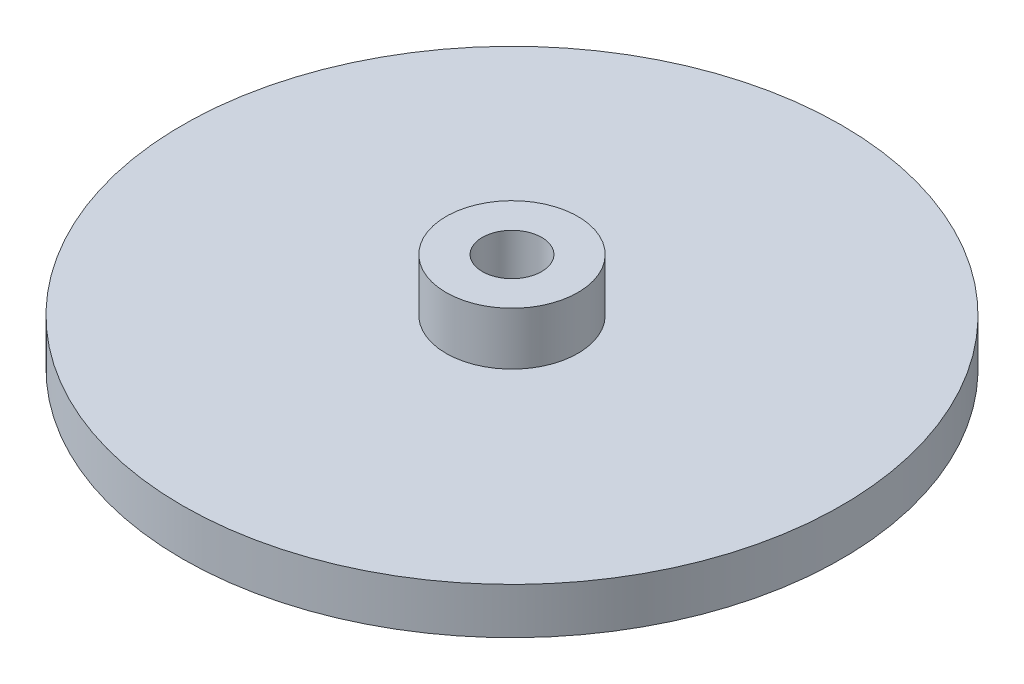
ISO-10303-21;
HEADER;
FILE_DESCRIPTION(('STEP AP214'),'2;1');
FILE_NAME('part.step','',(''),(''),'','','');
FILE_SCHEMA(('AUTOMOTIVE_DESIGN { 1 0 10303 214 1 1 1 1 }'));
ENDSEC;
DATA;
#1=APPLICATION_CONTEXT('core data for automotive mechanical design processes');
#2=APPLICATION_PROTOCOL_DEFINITION('international standard','automotive_design',2000,#1);
#3=PRODUCT_CONTEXT('',#1,'mechanical');
#4=PRODUCT('Part','Part','',(#3));
#5=PRODUCT_RELATED_PRODUCT_CATEGORY('part','',(#4));
#6=PRODUCT_DEFINITION_FORMATION('','',#4);
#7=PRODUCT_DEFINITION_CONTEXT('part definition',#1,'design');
#8=PRODUCT_DEFINITION('design','',#6,#7);
#9=PRODUCT_DEFINITION_SHAPE('','',#8);
#10=(LENGTH_UNIT() NAMED_UNIT(*) SI_UNIT(.MILLI.,.METRE.));
#11=(NAMED_UNIT(*) PLANE_ANGLE_UNIT() SI_UNIT($,.RADIAN.));
#12=(NAMED_UNIT(*) SI_UNIT($,.STERADIAN.) SOLID_ANGLE_UNIT());
#13=UNCERTAINTY_MEASURE_WITH_UNIT(LENGTH_MEASURE(1.E-05),#10,'distance_accuracy_value','');
#14=(GEOMETRIC_REPRESENTATION_CONTEXT(3) GLOBAL_UNCERTAINTY_ASSIGNED_CONTEXT((#13)) GLOBAL_UNIT_ASSIGNED_CONTEXT((#10,
#11,#12)) REPRESENTATION_CONTEXT('',''));
#15=CARTESIAN_POINT('',(0.,0.,0.));
#16=DIRECTION('',(0.,0.,1.));
#17=DIRECTION('',(1.,0.,0.));
#18=AXIS2_PLACEMENT_3D('',#15,#16,#17);
#19=CARTESIAN_POINT('',(0.,2.,0.));
#20=DIRECTION('',(0.,-1.,0.));
#21=DIRECTION('',(0.,0.,-1.));
#22=AXIS2_PLACEMENT_3D('',#19,#20,#21);
#23=CYLINDRICAL_SURFACE('',#22,25.);
#24=CARTESIAN_POINT('',(0.,2.,0.));
#25=DIRECTION('',(0.,1.,0.));
#26=DIRECTION('',(0.,0.,1.));
#27=AXIS2_PLACEMENT_3D('',#24,#25,#26);
#28=CIRCLE('',#27,25.);
#29=CARTESIAN_POINT('',(0.,2.,25.));
#30=VERTEX_POINT('',#29);
#31=EDGE_CURVE('E48',#30,#30,#28,.T.);
#32=ORIENTED_EDGE('',*,*,#31,.F.);
#33=EDGE_LOOP('',(#32));
#34=FACE_BOUND('',#33,.T.);
#35=CARTESIAN_POINT('',(0.,-1.5,0.));
#36=DIRECTION('',(0.,-1.,0.));
#37=DIRECTION('',(0.,0.,-1.));
#38=AXIS2_PLACEMENT_3D('',#35,#36,#37);
#39=CIRCLE('',#38,25.);
#40=CARTESIAN_POINT('',(0.,-1.5,-25.));
#41=VERTEX_POINT('',#40);
#42=EDGE_CURVE('E70',#41,#41,#39,.T.);
#43=ORIENTED_EDGE('',*,*,#42,.F.);
#44=EDGE_LOOP('',(#43));
#45=FACE_BOUND('',#44,.T.);
#46=ADVANCED_FACE('F45',(#34,#45),#23,.T.);
#47=CARTESIAN_POINT('',(0.,2.,0.));
#48=DIRECTION('',(0.,1.,0.));
#49=DIRECTION('',(0.,0.,1.));
#50=AXIS2_PLACEMENT_3D('',#47,#48,#49);
#51=PLANE('',#50);
#52=CARTESIAN_POINT('',(0.,2.,0.));
#53=DIRECTION('',(0.,1.,0.));
#54=DIRECTION('',(0.,0.,1.));
#55=AXIS2_PLACEMENT_3D('',#52,#53,#54);
#56=CIRCLE('',#55,5.);
#57=CARTESIAN_POINT('',(0.,2.,5.));
#58=VERTEX_POINT('',#57);
#59=EDGE_CURVE('E11',#58,#58,#56,.T.);
#60=ORIENTED_EDGE('',*,*,#59,.F.);
#61=EDGE_LOOP('',(#60));
#62=FACE_BOUND('',#61,.T.);
#63=ORIENTED_EDGE('',*,*,#31,.T.);
#64=EDGE_LOOP('',(#63));
#65=FACE_BOUND('',#64,.T.);
#66=ADVANCED_FACE('F96',(#62,#65),#51,.T.);
#67=CARTESIAN_POINT('',(0.,6.,0.));
#68=DIRECTION('',(0.,-1.,0.));
#69=DIRECTION('',(0.,0.,-1.));
#70=AXIS2_PLACEMENT_3D('',#67,#68,#69);
#71=CYLINDRICAL_SURFACE('',#70,5.);
#72=CARTESIAN_POINT('',(0.,6.,0.));
#73=DIRECTION('',(0.,1.,0.));
#74=DIRECTION('',(0.,0.,1.));
#75=AXIS2_PLACEMENT_3D('',#72,#73,#74);
#76=CIRCLE('',#75,5.);
#77=CARTESIAN_POINT('',(0.,6.,5.));
#78=VERTEX_POINT('',#77);
#79=EDGE_CURVE('E57',#78,#78,#76,.T.);
#80=ORIENTED_EDGE('',*,*,#79,.F.);
#81=EDGE_LOOP('',(#80));
#82=FACE_BOUND('',#81,.T.);
#83=ORIENTED_EDGE('',*,*,#59,.T.);
#84=EDGE_LOOP('',(#83));
#85=FACE_BOUND('',#84,.T.);
#86=ADVANCED_FACE('F101',(#82,#85),#71,.T.);
#87=CARTESIAN_POINT('',(0.,6.,0.));
#88=DIRECTION('',(0.,1.,0.));
#89=DIRECTION('',(0.,0.,1.));
#90=AXIS2_PLACEMENT_3D('',#87,#88,#89);
#91=PLANE('',#90);
#92=CARTESIAN_POINT('',(0.,6.,0.));
#93=DIRECTION('',(0.,1.,0.));
#94=DIRECTION('',(0.,0.,1.));
#95=AXIS2_PLACEMENT_3D('',#92,#93,#94);
#96=CIRCLE('',#95,2.25);
#97=CARTESIAN_POINT('',(0.,6.,2.25));
#98=VERTEX_POINT('',#97);
#99=EDGE_CURVE('E62',#98,#98,#96,.T.);
#100=ORIENTED_EDGE('',*,*,#99,.F.);
#101=EDGE_LOOP('',(#100));
#102=FACE_BOUND('',#101,.T.);
#103=ORIENTED_EDGE('',*,*,#79,.T.);
#104=EDGE_LOOP('',(#103));
#105=FACE_BOUND('',#104,.T.);
#106=ADVANCED_FACE('F111',(#102,#105),#91,.T.);
#107=CARTESIAN_POINT('',(0.,5.,0.));
#108=DIRECTION('',(0.,-1.,0.));
#109=DIRECTION('',(0.,0.,-1.));
#110=AXIS2_PLACEMENT_3D('',#107,#108,#109);
#111=CYLINDRICAL_SURFACE('',#110,4.5);
#112=CARTESIAN_POINT('',(0.,1.5,0.));
#113=DIRECTION('',(0.,-1.,0.));
#114=DIRECTION('',(0.,0.,-1.));
#115=AXIS2_PLACEMENT_3D('',#112,#113,#114);
#116=CIRCLE('',#115,4.5);
#117=CARTESIAN_POINT('',(0.,1.5,-4.5));
#118=VERTEX_POINT('',#117);
#119=EDGE_CURVE('E74',#118,#118,#116,.T.);
#120=ORIENTED_EDGE('',*,*,#119,.F.);
#121=EDGE_LOOP('',(#120));
#122=FACE_BOUND('',#121,.T.);
#123=CARTESIAN_POINT('',(0.,-1.5,0.));
#124=DIRECTION('',(0.,-1.,0.));
#125=DIRECTION('',(0.,0.,-1.));
#126=AXIS2_PLACEMENT_3D('',#123,#124,#125);
#127=CIRCLE('',#126,4.5);
#128=CARTESIAN_POINT('',(0.,-1.5,-4.5));
#129=VERTEX_POINT('',#128);
#130=EDGE_CURVE('E66',#129,#129,#127,.F.);
#131=ORIENTED_EDGE('',*,*,#130,.F.);
#132=EDGE_LOOP('',(#131));
#133=FACE_BOUND('',#132,.T.);
#134=ADVANCED_FACE('F109',(#122,#133),#111,.F.);
#135=CARTESIAN_POINT('',(0.,15.,0.));
#136=DIRECTION('',(0.,-1.,0.));
#137=DIRECTION('',(0.,0.,-1.));
#138=AXIS2_PLACEMENT_3D('',#135,#136,#137);
#139=CYLINDRICAL_SURFACE('',#138,2.25);
#140=ORIENTED_EDGE('',*,*,#99,.T.);
#141=EDGE_LOOP('',(#140));
#142=FACE_BOUND('',#141,.T.);
#143=CARTESIAN_POINT('',(0.,1.5,0.));
#144=DIRECTION('',(0.,-1.,0.));
#145=DIRECTION('',(0.,0.,-1.));
#146=AXIS2_PLACEMENT_3D('',#143,#144,#145);
#147=CIRCLE('',#146,2.25);
#148=CARTESIAN_POINT('',(0.,1.5,-2.25));
#149=VERTEX_POINT('',#148);
#150=EDGE_CURVE('E78',#149,#149,#147,.T.);
#151=ORIENTED_EDGE('',*,*,#150,.T.);
#152=EDGE_LOOP('',(#151));
#153=FACE_BOUND('',#152,.T.);
#154=ADVANCED_FACE('F83',(#142,#153),#139,.F.);
#155=CARTESIAN_POINT('',(0.,-1.5,0.));
#156=DIRECTION('',(0.,-1.,0.));
#157=DIRECTION('',(0.,0.,-1.));
#158=AXIS2_PLACEMENT_3D('',#155,#156,#157);
#159=PLANE('',#158);
#160=ORIENTED_EDGE('',*,*,#42,.T.);
#161=EDGE_LOOP('',(#160));
#162=FACE_BOUND('',#161,.T.);
#163=ORIENTED_EDGE('',*,*,#130,.T.);
#164=EDGE_LOOP('',(#163));
#165=FACE_BOUND('',#164,.T.);
#166=ADVANCED_FACE('F87',(#162,#165),#159,.T.);
#167=CARTESIAN_POINT('',(0.,1.5,0.));
#168=DIRECTION('',(0.,-1.,0.));
#169=DIRECTION('',(0.,0.,-1.));
#170=AXIS2_PLACEMENT_3D('',#167,#168,#169);
#171=PLANE('',#170);
#172=ORIENTED_EDGE('',*,*,#119,.T.);
#173=EDGE_LOOP('',(#172));
#174=FACE_BOUND('',#173,.T.);
#175=ORIENTED_EDGE('',*,*,#150,.F.);
#176=EDGE_LOOP('',(#175));
#177=FACE_BOUND('',#176,.T.);
#178=ADVANCED_FACE('F85',(#174,#177),#171,.T.);
#179=CLOSED_SHELL('',(#46,#66,#86,#106,#134,#154,#166,#178));
#180=MANIFOLD_SOLID_BREP('B2',#179);
#181=ADVANCED_BREP_SHAPE_REPRESENTATION('',(#18,#180),#14);
#182=SHAPE_DEFINITION_REPRESENTATION(#9,#181);
ENDSEC;
END-ISO-10303-21;
